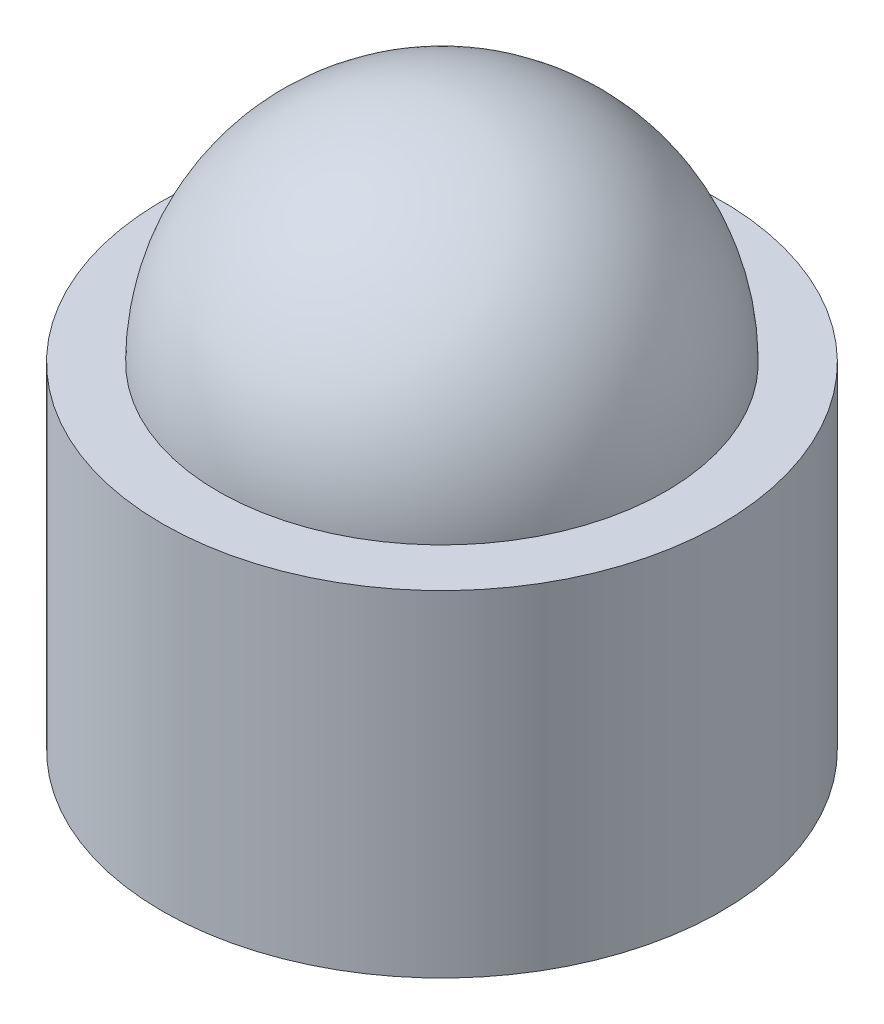
ISO-10303-21;
HEADER;
FILE_DESCRIPTION(('STEP AP214'),'2;1');
FILE_NAME('part.step','',(''),(''),'','','');
FILE_SCHEMA(('AUTOMOTIVE_DESIGN { 1 0 10303 214 1 1 1 1 }'));
ENDSEC;
DATA;
#1=APPLICATION_CONTEXT('core data for automotive mechanical design processes');
#2=APPLICATION_PROTOCOL_DEFINITION('international standard','automotive_design',2000,#1);
#3=PRODUCT_CONTEXT('',#1,'mechanical');
#4=PRODUCT('Part','Part','',(#3));
#5=PRODUCT_RELATED_PRODUCT_CATEGORY('part','',(#4));
#6=PRODUCT_DEFINITION_FORMATION('','',#4);
#7=PRODUCT_DEFINITION_CONTEXT('part definition',#1,'design');
#8=PRODUCT_DEFINITION('design','',#6,#7);
#9=PRODUCT_DEFINITION_SHAPE('','',#8);
#10=(LENGTH_UNIT() NAMED_UNIT(*) SI_UNIT(.MILLI.,.METRE.));
#11=(NAMED_UNIT(*) PLANE_ANGLE_UNIT() SI_UNIT($,.RADIAN.));
#12=(NAMED_UNIT(*) SI_UNIT($,.STERADIAN.) SOLID_ANGLE_UNIT());
#13=UNCERTAINTY_MEASURE_WITH_UNIT(LENGTH_MEASURE(1.E-05),#10,'distance_accuracy_value','');
#14=(GEOMETRIC_REPRESENTATION_CONTEXT(3) GLOBAL_UNCERTAINTY_ASSIGNED_CONTEXT((#13)) GLOBAL_UNIT_ASSIGNED_CONTEXT((#10,
#11,#12)) REPRESENTATION_CONTEXT('',''));
#15=CARTESIAN_POINT('',(0.,0.,0.));
#16=DIRECTION('',(0.,0.,1.));
#17=DIRECTION('',(1.,0.,0.));
#18=AXIS2_PLACEMENT_3D('',#15,#16,#17);
#19=CARTESIAN_POINT('',(0.,30.,0.));
#20=DIRECTION('',(0.,-1.,0.));
#21=DIRECTION('',(0.,0.,-1.));
#22=AXIS2_PLACEMENT_3D('',#19,#20,#21);
#23=CYLINDRICAL_SURFACE('',#22,25.);
#24=CARTESIAN_POINT('',(0.,30.,0.));
#25=DIRECTION('',(0.,1.,0.));
#26=DIRECTION('',(0.,0.,1.));
#27=AXIS2_PLACEMENT_3D('',#24,#25,#26);
#28=CIRCLE('',#27,25.);
#29=CARTESIAN_POINT('',(0.,30.,25.));
#30=VERTEX_POINT('',#29);
#31=EDGE_CURVE('E10',#30,#30,#28,.T.);
#32=ORIENTED_EDGE('',*,*,#31,.F.);
#33=EDGE_LOOP('',(#32));
#34=FACE_BOUND('',#33,.T.);
#35=CARTESIAN_POINT('',(0.,0.,0.));
#36=DIRECTION('',(0.,1.,0.));
#37=DIRECTION('',(0.,0.,1.));
#38=AXIS2_PLACEMENT_3D('',#35,#36,#37);
#39=CIRCLE('',#38,25.);
#40=CARTESIAN_POINT('',(0.,0.,25.));
#41=VERTEX_POINT('',#40);
#42=EDGE_CURVE('E40',#41,#41,#39,.T.);
#43=ORIENTED_EDGE('',*,*,#42,.T.);
#44=EDGE_LOOP('',(#43));
#45=FACE_BOUND('',#44,.T.);
#46=ADVANCED_FACE('F37',(#34,#45),#23,.T.);
#47=CARTESIAN_POINT('',(0.,30.,0.));
#48=DIRECTION('',(0.,1.,0.));
#49=DIRECTION('',(0.,0.,1.));
#50=AXIS2_PLACEMENT_3D('',#47,#48,#49);
#51=PLANE('',#50);
#52=CARTESIAN_POINT('',(0.,30.,0.));
#53=DIRECTION('',(0.,-1.,0.));
#54=DIRECTION('',(0.845711317446924,0.,0.533640672683584));
#55=AXIS2_PLACEMENT_3D('',#52,#53,#54);
#56=CIRCLE('',#55,20.);
#57=CARTESIAN_POINT('',(16.9142263489385,30.0000000000001,10.6728134536717));
#58=VERTEX_POINT('',#57);
#59=EDGE_CURVE('E49',#58,#58,#56,.T.);
#60=ORIENTED_EDGE('',*,*,#59,.T.);
#61=EDGE_LOOP('',(#60));
#62=FACE_BOUND('',#61,.T.);
#63=ORIENTED_EDGE('',*,*,#31,.T.);
#64=EDGE_LOOP('',(#63));
#65=FACE_BOUND('',#64,.T.);
#66=ADVANCED_FACE('F55',(#62,#65),#51,.T.);
#67=CARTESIAN_POINT('',(0.,0.,0.));
#68=DIRECTION('',(0.,1.,0.));
#69=DIRECTION('',(0.,0.,1.));
#70=AXIS2_PLACEMENT_3D('',#67,#68,#69);
#71=PLANE('',#70);
#72=ORIENTED_EDGE('',*,*,#42,.F.);
#73=EDGE_LOOP('',(#72));
#74=FACE_BOUND('',#73,.T.);
#75=ADVANCED_FACE('F59',(#74),#71,.F.);
#76=CARTESIAN_POINT('',(0.,30.,0.));
#77=DIRECTION('',(-0.482886802116405,0.,-0.875682782942426));
#78=DIRECTION('',(-0.875682782942426,0.,0.482886802116405));
#79=AXIS2_PLACEMENT_3D('',#76,#77,#78);
#80=SPHERICAL_SURFACE('',#79,20.);
#81=CARTESIAN_POINT('',(0.,30.,0.));
#82=DIRECTION('',(0.,-1.,0.));
#83=DIRECTION('',(0.845711317446924,0.,0.533640672683584));
#84=AXIS2_PLACEMENT_3D('',#81,#82,#83);
#85=SPHERICAL_SURFACE('',#84,20.);
#86=ORIENTED_EDGE('',*,*,#59,.F.);
#87=EDGE_LOOP('',(#86));
#88=FACE_BOUND('',#87,.T.);
#89=ADVANCED_FACE('F57',(#88),#85,.T.);
#90=CLOSED_SHELL('',(#46,#66,#75,#89));
#91=MANIFOLD_SOLID_BREP('B2',#90);
#92=ADVANCED_BREP_SHAPE_REPRESENTATION('',(#18,#91),#14);
#93=SHAPE_DEFINITION_REPRESENTATION(#9,#92);
ENDSEC;
END-ISO-10303-21;
